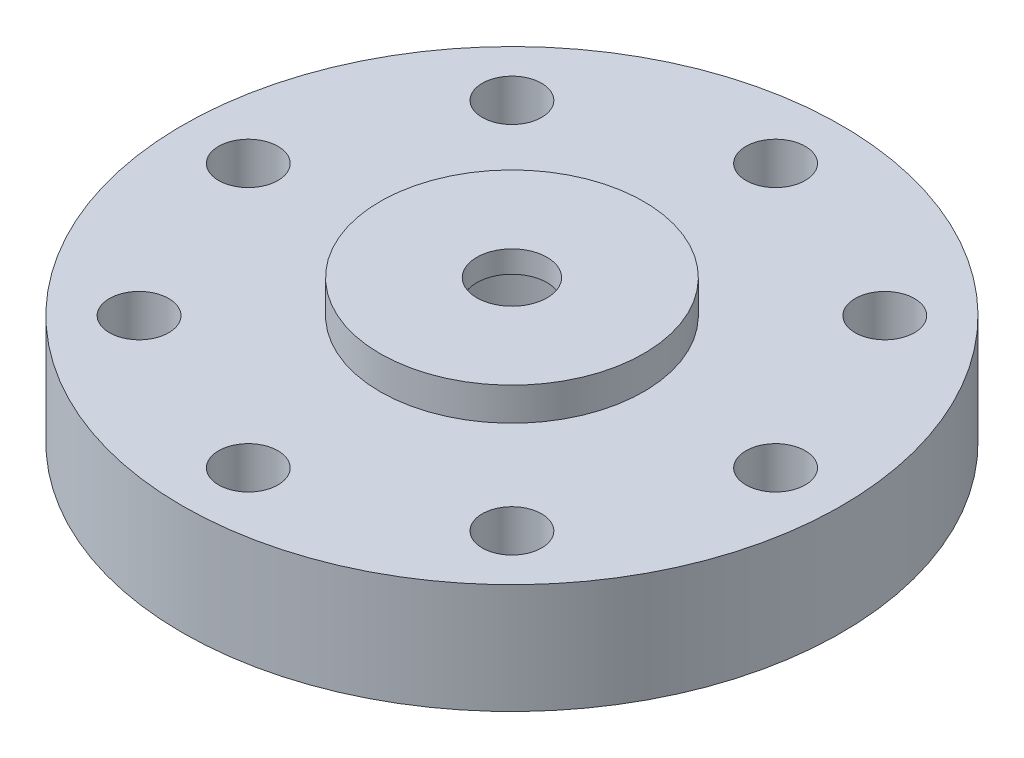
ISO-10303-21;
HEADER;
FILE_DESCRIPTION(('STEP AP214'),'2;1');
FILE_NAME('part.step','',(''),(''),'','','');
FILE_SCHEMA(('AUTOMOTIVE_DESIGN { 1 0 10303 214 1 1 1 1 }'));
ENDSEC;
DATA;
#1=APPLICATION_CONTEXT('core data for automotive mechanical design processes');
#2=APPLICATION_PROTOCOL_DEFINITION('international standard','automotive_design',2000,#1);
#3=PRODUCT_CONTEXT('',#1,'mechanical');
#4=PRODUCT('Part','Part','',(#3));
#5=PRODUCT_RELATED_PRODUCT_CATEGORY('part','',(#4));
#6=PRODUCT_DEFINITION_FORMATION('','',#4);
#7=PRODUCT_DEFINITION_CONTEXT('part definition',#1,'design');
#8=PRODUCT_DEFINITION('design','',#6,#7);
#9=PRODUCT_DEFINITION_SHAPE('','',#8);
#10=(LENGTH_UNIT() NAMED_UNIT(*) SI_UNIT(.MILLI.,.METRE.));
#11=(NAMED_UNIT(*) PLANE_ANGLE_UNIT() SI_UNIT($,.RADIAN.));
#12=(NAMED_UNIT(*) SI_UNIT($,.STERADIAN.) SOLID_ANGLE_UNIT());
#13=UNCERTAINTY_MEASURE_WITH_UNIT(LENGTH_MEASURE(1.E-05),#10,'distance_accuracy_value','');
#14=(GEOMETRIC_REPRESENTATION_CONTEXT(3) GLOBAL_UNCERTAINTY_ASSIGNED_CONTEXT((#13)) GLOBAL_UNIT_ASSIGNED_CONTEXT((#10,
#11,#12)) REPRESENTATION_CONTEXT('',''));
#15=CARTESIAN_POINT('',(0.,0.,0.));
#16=DIRECTION('',(0.,0.,1.));
#17=DIRECTION('',(1.,0.,0.));
#18=AXIS2_PLACEMENT_3D('',#15,#16,#17);
#19=CARTESIAN_POINT('',(0.,6.5,0.));
#20=DIRECTION('',(0.,-1.,0.));
#21=DIRECTION('',(0.,0.,-1.));
#22=AXIS2_PLACEMENT_3D('',#19,#20,#21);
#23=CYLINDRICAL_SURFACE('',#22,1.6);
#24=CARTESIAN_POINT('',(0.,6.5,0.));
#25=DIRECTION('',(0.,-1.,0.));
#26=DIRECTION('',(0.,0.,-1.));
#27=AXIS2_PLACEMENT_3D('',#24,#25,#26);
#28=CIRCLE('',#27,1.6);
#29=CARTESIAN_POINT('',(0.,6.5,-1.6));
#30=VERTEX_POINT('',#29);
#31=EDGE_CURVE('E52',#30,#30,#28,.T.);
#32=ORIENTED_EDGE('',*,*,#31,.F.);
#33=EDGE_LOOP('',(#32));
#34=FACE_BOUND('',#33,.T.);
#35=CARTESIAN_POINT('',(0.,5.5,0.));
#36=DIRECTION('',(0.,-1.,0.));
#37=DIRECTION('',(0.,0.,-1.));
#38=AXIS2_PLACEMENT_3D('',#35,#36,#37);
#39=CIRCLE('',#38,1.6);
#40=CARTESIAN_POINT('',(0.,5.5,-1.6));
#41=VERTEX_POINT('',#40);
#42=EDGE_CURVE('E34',#41,#41,#39,.F.);
#43=ORIENTED_EDGE('',*,*,#42,.F.);
#44=EDGE_LOOP('',(#43));
#45=FACE_BOUND('',#44,.T.);
#46=ADVANCED_FACE('F30',(#34,#45),#23,.F.);
#47=CARTESIAN_POINT('',(0.,5.,0.));
#48=DIRECTION('',(0.,-1.,0.));
#49=DIRECTION('',(0.,0.,-1.));
#50=AXIS2_PLACEMENT_3D('',#47,#48,#49);
#51=CYLINDRICAL_SURFACE('',#50,15.);
#52=CARTESIAN_POINT('',(0.,5.,0.));
#53=DIRECTION('',(0.,1.,0.));
#54=DIRECTION('',(0.,0.,1.));
#55=AXIS2_PLACEMENT_3D('',#52,#53,#54);
#56=CIRCLE('',#55,15.);
#57=CARTESIAN_POINT('',(0.,5.,15.));
#58=VERTEX_POINT('',#57);
#59=EDGE_CURVE('E38',#58,#58,#56,.T.);
#60=ORIENTED_EDGE('',*,*,#59,.F.);
#61=EDGE_LOOP('',(#60));
#62=FACE_BOUND('',#61,.T.);
#63=CARTESIAN_POINT('',(0.,0.,0.));
#64=DIRECTION('',(0.,1.,0.));
#65=DIRECTION('',(0.,0.,1.));
#66=AXIS2_PLACEMENT_3D('',#63,#64,#65);
#67=CIRCLE('',#66,15.);
#68=CARTESIAN_POINT('',(0.,0.,15.));
#69=VERTEX_POINT('',#68);
#70=EDGE_CURVE('E43',#69,#69,#67,.T.);
#71=ORIENTED_EDGE('',*,*,#70,.T.);
#72=EDGE_LOOP('',(#71));
#73=FACE_BOUND('',#72,.T.);
#74=ADVANCED_FACE('F32',(#62,#73),#51,.T.);
#75=CARTESIAN_POINT('',(0.,5.,0.));
#76=DIRECTION('',(0.,1.,0.));
#77=DIRECTION('',(0.,0.,1.));
#78=AXIS2_PLACEMENT_3D('',#75,#76,#77);
#79=PLANE('',#78);
#80=CARTESIAN_POINT('',(-12.,5.,0.));
#81=DIRECTION('',(0.,1.,0.));
#82=DIRECTION('',(0.,0.,1.));
#83=AXIS2_PLACEMENT_3D('',#80,#81,#82);
#84=CIRCLE('',#83,1.35);
#85=CARTESIAN_POINT('',(-12.,5.,1.35));
#86=VERTEX_POINT('',#85);
#87=EDGE_CURVE('E111',#86,#86,#84,.T.);
#88=ORIENTED_EDGE('',*,*,#87,.F.);
#89=EDGE_LOOP('',(#88));
#90=FACE_BOUND('',#89,.T.);
#91=CARTESIAN_POINT('',(-8.48528137423856,5.,-8.48528137423859));
#92=DIRECTION('',(0.,1.,0.));
#93=DIRECTION('',(0.,0.,1.));
#94=AXIS2_PLACEMENT_3D('',#91,#92,#93);
#95=CIRCLE('',#94,1.35);
#96=CARTESIAN_POINT('',(-8.48528137423856,5.,-7.13528137423859));
#97=VERTEX_POINT('',#96);
#98=EDGE_CURVE('E105',#97,#97,#95,.T.);
#99=ORIENTED_EDGE('',*,*,#98,.F.);
#100=EDGE_LOOP('',(#99));
#101=FACE_BOUND('',#100,.T.);
#102=CARTESIAN_POINT('',(0.,5.,-12.));
#103=DIRECTION('',(0.,1.,0.));
#104=DIRECTION('',(0.,0.,1.));
#105=AXIS2_PLACEMENT_3D('',#102,#103,#104);
#106=CIRCLE('',#105,1.35);
#107=CARTESIAN_POINT('',(0.,5.,-10.65));
#108=VERTEX_POINT('',#107);
#109=EDGE_CURVE('E99',#108,#108,#106,.T.);
#110=ORIENTED_EDGE('',*,*,#109,.F.);
#111=EDGE_LOOP('',(#110));
#112=FACE_BOUND('',#111,.T.);
#113=CARTESIAN_POINT('',(8.48528137423862,5.,-8.48528137423852));
#114=DIRECTION('',(0.,1.,0.));
#115=DIRECTION('',(0.,0.,1.));
#116=AXIS2_PLACEMENT_3D('',#113,#114,#115);
#117=CIRCLE('',#116,1.35);
#118=CARTESIAN_POINT('',(8.48528137423862,5.,-7.13528137423852));
#119=VERTEX_POINT('',#118);
#120=EDGE_CURVE('E93',#119,#119,#117,.T.);
#121=ORIENTED_EDGE('',*,*,#120,.F.);
#122=EDGE_LOOP('',(#121));
#123=FACE_BOUND('',#122,.T.);
#124=CARTESIAN_POINT('',(12.,5.,0.));
#125=DIRECTION('',(0.,1.,0.));
#126=DIRECTION('',(0.,0.,1.));
#127=AXIS2_PLACEMENT_3D('',#124,#125,#126);
#128=CIRCLE('',#127,1.35);
#129=CARTESIAN_POINT('',(12.,5.,1.35000000000008));
#130=VERTEX_POINT('',#129);
#131=EDGE_CURVE('E87',#130,#130,#128,.T.);
#132=ORIENTED_EDGE('',*,*,#131,.F.);
#133=EDGE_LOOP('',(#132));
#134=FACE_BOUND('',#133,.T.);
#135=CARTESIAN_POINT('',(8.4852813742385,5.,8.48528137423865));
#136=DIRECTION('',(0.,1.,0.));
#137=DIRECTION('',(0.,0.,1.));
#138=AXIS2_PLACEMENT_3D('',#135,#136,#137);
#139=CIRCLE('',#138,1.35);
#140=CARTESIAN_POINT('',(8.4852813742385,5.,9.83528137423865));
#141=VERTEX_POINT('',#140);
#142=EDGE_CURVE('E81',#141,#141,#139,.T.);
#143=ORIENTED_EDGE('',*,*,#142,.F.);
#144=EDGE_LOOP('',(#143));
#145=FACE_BOUND('',#144,.T.);
#146=CARTESIAN_POINT('',(-1.25693328198353E-13,5.,12.));
#147=DIRECTION('',(0.,1.,0.));
#148=DIRECTION('',(0.,0.,1.));
#149=AXIS2_PLACEMENT_3D('',#146,#147,#148);
#150=CIRCLE('',#149,1.35);
#151=CARTESIAN_POINT('',(-1.25693328198353E-13,5.,13.35));
#152=VERTEX_POINT('',#151);
#153=EDGE_CURVE('E75',#152,#152,#150,.T.);
#154=ORIENTED_EDGE('',*,*,#153,.F.);
#155=EDGE_LOOP('',(#154));
#156=FACE_BOUND('',#155,.T.);
#157=CARTESIAN_POINT('',(-8.48528137423868,5.,8.48528137423847));
#158=DIRECTION('',(0.,1.,0.));
#159=DIRECTION('',(0.,0.,1.));
#160=AXIS2_PLACEMENT_3D('',#157,#158,#159);
#161=CIRCLE('',#160,1.35);
#162=CARTESIAN_POINT('',(-8.48528137423868,5.,9.83528137423847));
#163=VERTEX_POINT('',#162);
#164=EDGE_CURVE('E69',#163,#163,#161,.T.);
#165=ORIENTED_EDGE('',*,*,#164,.F.);
#166=EDGE_LOOP('',(#165));
#167=FACE_BOUND('',#166,.T.);
#168=CARTESIAN_POINT('',(0.,5.,0.));
#169=DIRECTION('',(0.,1.,0.));
#170=DIRECTION('',(0.,0.,1.));
#171=AXIS2_PLACEMENT_3D('',#168,#169,#170);
#172=CIRCLE('',#171,6.);
#173=CARTESIAN_POINT('',(0.,5.,6.));
#174=VERTEX_POINT('',#173);
#175=EDGE_CURVE('E10',#174,#174,#172,.T.);
#176=ORIENTED_EDGE('',*,*,#175,.F.);
#177=EDGE_LOOP('',(#176));
#178=FACE_BOUND('',#177,.T.);
#179=ORIENTED_EDGE('',*,*,#59,.T.);
#180=EDGE_LOOP('',(#179));
#181=FACE_BOUND('',#180,.T.);
#182=ADVANCED_FACE('F117',(#90,#101,#112,#123,#134,#145,#156,#167,#178,#181),#79,.T.);
#183=CARTESIAN_POINT('',(0.,0.,0.));
#184=DIRECTION('',(0.,1.,0.));
#185=DIRECTION('',(0.,0.,1.));
#186=AXIS2_PLACEMENT_3D('',#183,#184,#185);
#187=PLANE('',#186);
#188=CARTESIAN_POINT('',(-12.,0.,0.));
#189=DIRECTION('',(0.,1.,0.));
#190=DIRECTION('',(0.,0.,1.));
#191=AXIS2_PLACEMENT_3D('',#188,#189,#190);
#192=CIRCLE('',#191,1.35);
#193=CARTESIAN_POINT('',(-12.,0.,1.35));
#194=VERTEX_POINT('',#193);
#195=EDGE_CURVE('E108',#194,#194,#192,.T.);
#196=ORIENTED_EDGE('',*,*,#195,.T.);
#197=EDGE_LOOP('',(#196));
#198=FACE_BOUND('',#197,.T.);
#199=CARTESIAN_POINT('',(-8.48528137423856,0.,-8.48528137423859));
#200=DIRECTION('',(0.,1.,0.));
#201=DIRECTION('',(0.,0.,1.));
#202=AXIS2_PLACEMENT_3D('',#199,#200,#201);
#203=CIRCLE('',#202,1.35);
#204=CARTESIAN_POINT('',(-8.48528137423856,0.,-7.13528137423859));
#205=VERTEX_POINT('',#204);
#206=EDGE_CURVE('E102',#205,#205,#203,.T.);
#207=ORIENTED_EDGE('',*,*,#206,.T.);
#208=EDGE_LOOP('',(#207));
#209=FACE_BOUND('',#208,.T.);
#210=CARTESIAN_POINT('',(0.,0.,-12.));
#211=DIRECTION('',(0.,1.,0.));
#212=DIRECTION('',(0.,0.,1.));
#213=AXIS2_PLACEMENT_3D('',#210,#211,#212);
#214=CIRCLE('',#213,1.35);
#215=CARTESIAN_POINT('',(0.,0.,-10.65));
#216=VERTEX_POINT('',#215);
#217=EDGE_CURVE('E96',#216,#216,#214,.T.);
#218=ORIENTED_EDGE('',*,*,#217,.T.);
#219=EDGE_LOOP('',(#218));
#220=FACE_BOUND('',#219,.T.);
#221=CARTESIAN_POINT('',(8.48528137423862,0.,-8.48528137423852));
#222=DIRECTION('',(0.,1.,0.));
#223=DIRECTION('',(0.,0.,1.));
#224=AXIS2_PLACEMENT_3D('',#221,#222,#223);
#225=CIRCLE('',#224,1.35);
#226=CARTESIAN_POINT('',(8.48528137423862,0.,-7.13528137423852));
#227=VERTEX_POINT('',#226);
#228=EDGE_CURVE('E90',#227,#227,#225,.T.);
#229=ORIENTED_EDGE('',*,*,#228,.T.);
#230=EDGE_LOOP('',(#229));
#231=FACE_BOUND('',#230,.T.);
#232=CARTESIAN_POINT('',(12.,0.,0.));
#233=DIRECTION('',(0.,1.,0.));
#234=DIRECTION('',(0.,0.,1.));
#235=AXIS2_PLACEMENT_3D('',#232,#233,#234);
#236=CIRCLE('',#235,1.35);
#237=CARTESIAN_POINT('',(12.,0.,1.35000000000008));
#238=VERTEX_POINT('',#237);
#239=EDGE_CURVE('E84',#238,#238,#236,.T.);
#240=ORIENTED_EDGE('',*,*,#239,.T.);
#241=EDGE_LOOP('',(#240));
#242=FACE_BOUND('',#241,.T.);
#243=CARTESIAN_POINT('',(8.4852813742385,0.,8.48528137423865));
#244=DIRECTION('',(0.,1.,0.));
#245=DIRECTION('',(0.,0.,1.));
#246=AXIS2_PLACEMENT_3D('',#243,#244,#245);
#247=CIRCLE('',#246,1.35);
#248=CARTESIAN_POINT('',(8.4852813742385,0.,9.83528137423865));
#249=VERTEX_POINT('',#248);
#250=EDGE_CURVE('E78',#249,#249,#247,.T.);
#251=ORIENTED_EDGE('',*,*,#250,.T.);
#252=EDGE_LOOP('',(#251));
#253=FACE_BOUND('',#252,.T.);
#254=CARTESIAN_POINT('',(-1.25693328198353E-13,0.,12.));
#255=DIRECTION('',(0.,1.,0.));
#256=DIRECTION('',(0.,0.,1.));
#257=AXIS2_PLACEMENT_3D('',#254,#255,#256);
#258=CIRCLE('',#257,1.35);
#259=CARTESIAN_POINT('',(-1.25693328198353E-13,0.,13.35));
#260=VERTEX_POINT('',#259);
#261=EDGE_CURVE('E72',#260,#260,#258,.T.);
#262=ORIENTED_EDGE('',*,*,#261,.T.);
#263=EDGE_LOOP('',(#262));
#264=FACE_BOUND('',#263,.T.);
#265=CARTESIAN_POINT('',(-8.48528137423868,0.,8.48528137423847));
#266=DIRECTION('',(0.,1.,0.));
#267=DIRECTION('',(0.,0.,1.));
#268=AXIS2_PLACEMENT_3D('',#265,#266,#267);
#269=CIRCLE('',#268,1.35);
#270=CARTESIAN_POINT('',(-8.48528137423868,0.,9.83528137423847));
#271=VERTEX_POINT('',#270);
#272=EDGE_CURVE('E64',#271,#271,#269,.T.);
#273=ORIENTED_EDGE('',*,*,#272,.T.);
#274=EDGE_LOOP('',(#273));
#275=FACE_BOUND('',#274,.T.);
#276=CARTESIAN_POINT('',(0.,0.,0.));
#277=DIRECTION('',(0.,-1.,0.));
#278=DIRECTION('',(0.,0.,-1.));
#279=AXIS2_PLACEMENT_3D('',#276,#277,#278);
#280=CIRCLE('',#279,3.7);
#281=CARTESIAN_POINT('',(0.,0.,-3.7));
#282=VERTEX_POINT('',#281);
#283=EDGE_CURVE('E61',#282,#282,#280,.T.);
#284=ORIENTED_EDGE('',*,*,#283,.F.);
#285=EDGE_LOOP('',(#284));
#286=FACE_BOUND('',#285,.T.);
#287=ORIENTED_EDGE('',*,*,#70,.F.);
#288=EDGE_LOOP('',(#287));
#289=FACE_BOUND('',#288,.T.);
#290=ADVANCED_FACE('F120',(#198,#209,#220,#231,#242,#253,#264,#275,#286,#289),#187,.F.);
#291=CARTESIAN_POINT('',(0.,6.5,0.));
#292=DIRECTION('',(0.,-1.,0.));
#293=DIRECTION('',(0.,0.,-1.));
#294=AXIS2_PLACEMENT_3D('',#291,#292,#293);
#295=CYLINDRICAL_SURFACE('',#294,6.);
#296=CARTESIAN_POINT('',(0.,6.5,0.));
#297=DIRECTION('',(0.,1.,0.));
#298=DIRECTION('',(0.,0.,1.));
#299=AXIS2_PLACEMENT_3D('',#296,#297,#298);
#300=CIRCLE('',#299,6.);
#301=CARTESIAN_POINT('',(0.,6.5,6.));
#302=VERTEX_POINT('',#301);
#303=EDGE_CURVE('E46',#302,#302,#300,.T.);
#304=ORIENTED_EDGE('',*,*,#303,.F.);
#305=EDGE_LOOP('',(#304));
#306=FACE_BOUND('',#305,.T.);
#307=ORIENTED_EDGE('',*,*,#175,.T.);
#308=EDGE_LOOP('',(#307));
#309=FACE_BOUND('',#308,.T.);
#310=ADVANCED_FACE('F156',(#306,#309),#295,.T.);
#311=CARTESIAN_POINT('',(0.,6.5,0.));
#312=DIRECTION('',(0.,1.,0.));
#313=DIRECTION('',(0.,0.,1.));
#314=AXIS2_PLACEMENT_3D('',#311,#312,#313);
#315=PLANE('',#314);
#316=ORIENTED_EDGE('',*,*,#31,.T.);
#317=EDGE_LOOP('',(#316));
#318=FACE_BOUND('',#317,.T.);
#319=ORIENTED_EDGE('',*,*,#303,.T.);
#320=EDGE_LOOP('',(#319));
#321=FACE_BOUND('',#320,.T.);
#322=ADVANCED_FACE('F152',(#318,#321),#315,.T.);
#323=CARTESIAN_POINT('',(0.,5.5,0.));
#324=DIRECTION('',(0.,-1.,0.));
#325=DIRECTION('',(0.,0.,-1.));
#326=AXIS2_PLACEMENT_3D('',#323,#324,#325);
#327=PLANE('',#326);
#328=CARTESIAN_POINT('',(0.,5.5,0.));
#329=DIRECTION('',(0.,-1.,0.));
#330=DIRECTION('',(0.,0.,-1.));
#331=AXIS2_PLACEMENT_3D('',#328,#329,#330);
#332=CIRCLE('',#331,3.7);
#333=CARTESIAN_POINT('',(0.,5.5,-3.7));
#334=VERTEX_POINT('',#333);
#335=EDGE_CURVE('E59',#334,#334,#332,.T.);
#336=ORIENTED_EDGE('',*,*,#335,.T.);
#337=EDGE_LOOP('',(#336));
#338=FACE_BOUND('',#337,.T.);
#339=ORIENTED_EDGE('',*,*,#42,.T.);
#340=EDGE_LOOP('',(#339));
#341=FACE_BOUND('',#340,.T.);
#342=ADVANCED_FACE('F155',(#338,#341),#327,.T.);
#343=CARTESIAN_POINT('',(0.,5.5,0.));
#344=DIRECTION('',(0.,-1.,0.));
#345=DIRECTION('',(0.,0.,-1.));
#346=AXIS2_PLACEMENT_3D('',#343,#344,#345);
#347=CYLINDRICAL_SURFACE('',#346,3.7);
#348=ORIENTED_EDGE('',*,*,#335,.F.);
#349=EDGE_LOOP('',(#348));
#350=FACE_BOUND('',#349,.T.);
#351=ORIENTED_EDGE('',*,*,#283,.T.);
#352=EDGE_LOOP('',(#351));
#353=FACE_BOUND('',#352,.T.);
#354=ADVANCED_FACE('F150',(#350,#353),#347,.F.);
#355=CARTESIAN_POINT('',(-8.48528137423868,5.,8.48528137423847));
#356=DIRECTION('',(0.,1.,0.));
#357=DIRECTION('',(0.,0.,1.));
#358=AXIS2_PLACEMENT_3D('',#355,#356,#357);
#359=CYLINDRICAL_SURFACE('',#358,1.35);
#360=ORIENTED_EDGE('',*,*,#272,.F.);
#361=EDGE_LOOP('',(#360));
#362=FACE_BOUND('',#361,.T.);
#363=ORIENTED_EDGE('',*,*,#164,.T.);
#364=EDGE_LOOP('',(#363));
#365=FACE_BOUND('',#364,.T.);
#366=ADVANCED_FACE('F183',(#362,#365),#359,.F.);
#367=CARTESIAN_POINT('',(-1.25693328198353E-13,5.,12.));
#368=DIRECTION('',(0.,1.,0.));
#369=DIRECTION('',(0.,0.,1.));
#370=AXIS2_PLACEMENT_3D('',#367,#368,#369);
#371=CYLINDRICAL_SURFACE('',#370,1.35);
#372=ORIENTED_EDGE('',*,*,#261,.F.);
#373=EDGE_LOOP('',(#372));
#374=FACE_BOUND('',#373,.T.);
#375=ORIENTED_EDGE('',*,*,#153,.T.);
#376=EDGE_LOOP('',(#375));
#377=FACE_BOUND('',#376,.T.);
#378=ADVANCED_FACE('F189',(#374,#377),#371,.F.);
#379=CARTESIAN_POINT('',(8.4852813742385,5.,8.48528137423865));
#380=DIRECTION('',(0.,1.,0.));
#381=DIRECTION('',(0.,0.,1.));
#382=AXIS2_PLACEMENT_3D('',#379,#380,#381);
#383=CYLINDRICAL_SURFACE('',#382,1.35);
#384=ORIENTED_EDGE('',*,*,#250,.F.);
#385=EDGE_LOOP('',(#384));
#386=FACE_BOUND('',#385,.T.);
#387=ORIENTED_EDGE('',*,*,#142,.T.);
#388=EDGE_LOOP('',(#387));
#389=FACE_BOUND('',#388,.T.);
#390=ADVANCED_FACE('F201',(#386,#389),#383,.F.);
#391=CARTESIAN_POINT('',(12.,5.,0.));
#392=DIRECTION('',(0.,1.,0.));
#393=DIRECTION('',(0.,0.,1.));
#394=AXIS2_PLACEMENT_3D('',#391,#392,#393);
#395=CYLINDRICAL_SURFACE('',#394,1.35);
#396=ORIENTED_EDGE('',*,*,#239,.F.);
#397=EDGE_LOOP('',(#396));
#398=FACE_BOUND('',#397,.T.);
#399=ORIENTED_EDGE('',*,*,#131,.T.);
#400=EDGE_LOOP('',(#399));
#401=FACE_BOUND('',#400,.T.);
#402=ADVANCED_FACE('F205',(#398,#401),#395,.F.);
#403=CARTESIAN_POINT('',(8.48528137423862,5.,-8.48528137423852));
#404=DIRECTION('',(0.,1.,0.));
#405=DIRECTION('',(0.,0.,1.));
#406=AXIS2_PLACEMENT_3D('',#403,#404,#405);
#407=CYLINDRICAL_SURFACE('',#406,1.35);
#408=ORIENTED_EDGE('',*,*,#228,.F.);
#409=EDGE_LOOP('',(#408));
#410=FACE_BOUND('',#409,.T.);
#411=ORIENTED_EDGE('',*,*,#120,.T.);
#412=EDGE_LOOP('',(#411));
#413=FACE_BOUND('',#412,.T.);
#414=ADVANCED_FACE('F209',(#410,#413),#407,.F.);
#415=CARTESIAN_POINT('',(0.,5.,-12.));
#416=DIRECTION('',(0.,1.,0.));
#417=DIRECTION('',(0.,0.,1.));
#418=AXIS2_PLACEMENT_3D('',#415,#416,#417);
#419=CYLINDRICAL_SURFACE('',#418,1.35);
#420=ORIENTED_EDGE('',*,*,#217,.F.);
#421=EDGE_LOOP('',(#420));
#422=FACE_BOUND('',#421,.T.);
#423=ORIENTED_EDGE('',*,*,#109,.T.);
#424=EDGE_LOOP('',(#423));
#425=FACE_BOUND('',#424,.T.);
#426=ADVANCED_FACE('F213',(#422,#425),#419,.F.);
#427=CARTESIAN_POINT('',(-8.48528137423856,5.,-8.48528137423859));
#428=DIRECTION('',(0.,1.,0.));
#429=DIRECTION('',(0.,0.,1.));
#430=AXIS2_PLACEMENT_3D('',#427,#428,#429);
#431=CYLINDRICAL_SURFACE('',#430,1.35);
#432=ORIENTED_EDGE('',*,*,#206,.F.);
#433=EDGE_LOOP('',(#432));
#434=FACE_BOUND('',#433,.T.);
#435=ORIENTED_EDGE('',*,*,#98,.T.);
#436=EDGE_LOOP('',(#435));
#437=FACE_BOUND('',#436,.T.);
#438=ADVANCED_FACE('F217',(#434,#437),#431,.F.);
#439=CARTESIAN_POINT('',(-12.,5.,0.));
#440=DIRECTION('',(0.,1.,0.));
#441=DIRECTION('',(0.,0.,1.));
#442=AXIS2_PLACEMENT_3D('',#439,#440,#441);
#443=CYLINDRICAL_SURFACE('',#442,1.35);
#444=ORIENTED_EDGE('',*,*,#195,.F.);
#445=EDGE_LOOP('',(#444));
#446=FACE_BOUND('',#445,.T.);
#447=ORIENTED_EDGE('',*,*,#87,.T.);
#448=EDGE_LOOP('',(#447));
#449=FACE_BOUND('',#448,.T.);
#450=ADVANCED_FACE('F115',(#446,#449),#443,.F.);
#451=CLOSED_SHELL('',(#46,#74,#182,#290,#310,#322,#342,#354,#366,#378,#390,#402,#414,#426,#438,#450));
#452=MANIFOLD_SOLID_BREP('B2',#451);
#453=ADVANCED_BREP_SHAPE_REPRESENTATION('',(#18,#452),#14);
#454=SHAPE_DEFINITION_REPRESENTATION(#9,#453);
ENDSEC;
END-ISO-10303-21;
